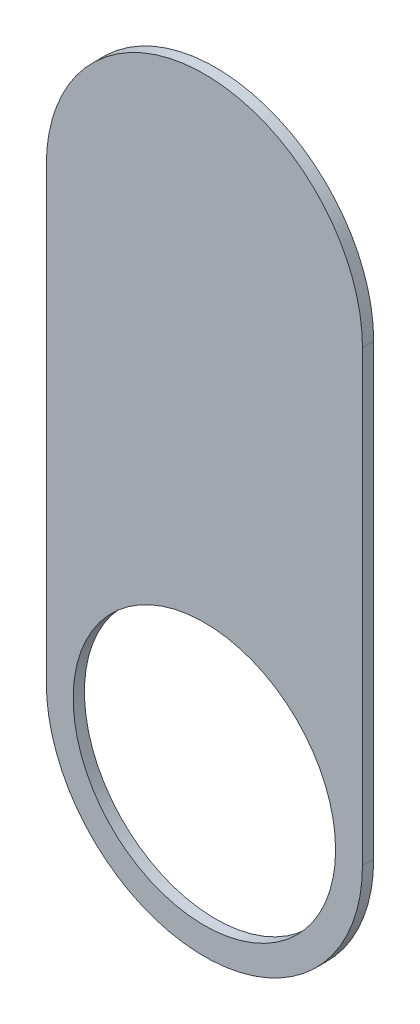
ISO-10303-21;
HEADER;
FILE_DESCRIPTION(('STEP AP214'),'2;1');
FILE_NAME('part.step','',(''),(''),'','','');
FILE_SCHEMA(('AUTOMOTIVE_DESIGN { 1 0 10303 214 1 1 1 1 }'));
ENDSEC;
DATA;
#1=APPLICATION_CONTEXT('core data for automotive mechanical design processes');
#2=APPLICATION_PROTOCOL_DEFINITION('international standard','automotive_design',2000,#1);
#3=PRODUCT_CONTEXT('',#1,'mechanical');
#4=PRODUCT('Part','Part','',(#3));
#5=PRODUCT_RELATED_PRODUCT_CATEGORY('part','',(#4));
#6=PRODUCT_DEFINITION_FORMATION('','',#4);
#7=PRODUCT_DEFINITION_CONTEXT('part definition',#1,'design');
#8=PRODUCT_DEFINITION('design','',#6,#7);
#9=PRODUCT_DEFINITION_SHAPE('','',#8);
#10=(LENGTH_UNIT() NAMED_UNIT(*) SI_UNIT(.MILLI.,.METRE.));
#11=(NAMED_UNIT(*) PLANE_ANGLE_UNIT() SI_UNIT($,.RADIAN.));
#12=(NAMED_UNIT(*) SI_UNIT($,.STERADIAN.) SOLID_ANGLE_UNIT());
#13=UNCERTAINTY_MEASURE_WITH_UNIT(LENGTH_MEASURE(1.E-05),#10,'distance_accuracy_value','');
#14=(GEOMETRIC_REPRESENTATION_CONTEXT(3) GLOBAL_UNCERTAINTY_ASSIGNED_CONTEXT((#13)) GLOBAL_UNIT_ASSIGNED_CONTEXT((#10,
#11,#12)) REPRESENTATION_CONTEXT('',''));
#15=CARTESIAN_POINT('',(0.,0.,0.));
#16=DIRECTION('',(0.,0.,1.));
#17=DIRECTION('',(1.,0.,0.));
#18=AXIS2_PLACEMENT_3D('',#15,#16,#17);
#19=CARTESIAN_POINT('',(35.8599994,113.5000016,0.));
#20=DIRECTION('',(-1.,0.,0.));
#21=DIRECTION('',(0.,1.,0.));
#22=AXIS2_PLACEMENT_3D('',#19,#20,#21);
#23=PLANE('',#22);
#24=DIRECTION('',(0.,1.,0.));
#25=VECTOR('',#24,1.);
#26=CARTESIAN_POINT('',(35.8599994,113.5000016,0.03556));
#27=LINE('',#26,#25);
#28=CARTESIAN_POINT('',(35.8599994,113.5000016,0.03556));
#29=VERTEX_POINT('',#28);
#30=CARTESIAN_POINT('',(35.8599994,114.9175756,0.03556));
#31=VERTEX_POINT('',#30);
#32=EDGE_CURVE('E11',#29,#31,#27,.T.);
#33=ORIENTED_EDGE('',*,*,#32,.F.);
#34=DIRECTION('',(0.,0.,1.));
#35=VECTOR('',#34,1.);
#36=CARTESIAN_POINT('',(35.8599994,113.5000016,0.));
#37=LINE('',#36,#35);
#38=CARTESIAN_POINT('',(35.8599994,113.5000016,0.));
#39=VERTEX_POINT('',#38);
#40=EDGE_CURVE('E24',#39,#29,#37,.T.);
#41=ORIENTED_EDGE('',*,*,#40,.F.);
#42=DIRECTION('',(0.,1.,0.));
#43=VECTOR('',#42,1.);
#44=CARTESIAN_POINT('',(35.8599994,113.5000016,0.));
#45=LINE('',#44,#43);
#46=CARTESIAN_POINT('',(35.8599994,114.9175756,0.));
#47=VERTEX_POINT('',#46);
#48=EDGE_CURVE('E96',#39,#47,#45,.T.);
#49=ORIENTED_EDGE('',*,*,#48,.T.);
#50=DIRECTION('',(0.,0.,1.));
#51=VECTOR('',#50,1.);
#52=CARTESIAN_POINT('',(35.8599994,114.9175756,0.));
#53=LINE('',#52,#51);
#54=EDGE_CURVE('E37',#47,#31,#53,.T.);
#55=ORIENTED_EDGE('',*,*,#54,.T.);
#56=EDGE_LOOP('',(#33,#41,#49,#55));
#57=FACE_BOUND('',#56,.T.);
#58=ADVANCED_FACE('F17',(#57),#23,.F.);
#59=CARTESIAN_POINT('',(35.3600004,113.5000016,0.));
#60=DIRECTION('',(0.,0.,-1.));
#61=DIRECTION('',(-1.,0.,0.));
#62=AXIS2_PLACEMENT_3D('',#59,#60,#61);
#63=CYLINDRICAL_SURFACE('',#62,0.499999000000002);
#64=CARTESIAN_POINT('',(35.3600004,113.5000016,0.03556));
#65=DIRECTION('',(0.,0.,1.));
#66=DIRECTION('',(-1.,0.,0.));
#67=AXIS2_PLACEMENT_3D('',#64,#65,#66);
#68=CIRCLE('',#67,0.499999000000002);
#69=CARTESIAN_POINT('',(34.8600014,113.5000016,0.03556));
#70=VERTEX_POINT('',#69);
#71=EDGE_CURVE('E92',#70,#29,#68,.T.);
#72=ORIENTED_EDGE('',*,*,#71,.F.);
#73=DIRECTION('',(0.,0.,1.));
#74=VECTOR('',#73,1.);
#75=CARTESIAN_POINT('',(34.8600014,113.5000016,0.));
#76=LINE('',#75,#74);
#77=CARTESIAN_POINT('',(34.8600014,113.5000016,0.));
#78=VERTEX_POINT('',#77);
#79=EDGE_CURVE('E90',#78,#70,#76,.T.);
#80=ORIENTED_EDGE('',*,*,#79,.F.);
#81=CARTESIAN_POINT('',(35.3600004,113.5000016,0.));
#82=DIRECTION('',(0.,0.,1.));
#83=DIRECTION('',(-1.,0.,0.));
#84=AXIS2_PLACEMENT_3D('',#81,#82,#83);
#85=CIRCLE('',#84,0.499999000000002);
#86=EDGE_CURVE('E88',#78,#39,#85,.T.);
#87=ORIENTED_EDGE('',*,*,#86,.T.);
#88=ORIENTED_EDGE('',*,*,#40,.T.);
#89=EDGE_LOOP('',(#72,#80,#87,#88));
#90=FACE_BOUND('',#89,.T.);
#91=ADVANCED_FACE('F111',(#90),#63,.T.);
#92=CARTESIAN_POINT('',(35.3600004,114.9175756,0.));
#93=DIRECTION('',(0.,0.,-1.));
#94=DIRECTION('',(1.,0.,0.));
#95=AXIS2_PLACEMENT_3D('',#92,#93,#94);
#96=CYLINDRICAL_SURFACE('',#95,0.499999000000002);
#97=CARTESIAN_POINT('',(35.3600004,114.9175756,0.03556));
#98=DIRECTION('',(0.,0.,1.));
#99=DIRECTION('',(1.,0.,0.));
#100=AXIS2_PLACEMENT_3D('',#97,#98,#99);
#101=CIRCLE('',#100,0.499999000000002);
#102=CARTESIAN_POINT('',(34.8600014,114.9175756,0.03556));
#103=VERTEX_POINT('',#102);
#104=EDGE_CURVE('E85',#31,#103,#101,.T.);
#105=ORIENTED_EDGE('',*,*,#104,.F.);
#106=ORIENTED_EDGE('',*,*,#54,.F.);
#107=CARTESIAN_POINT('',(35.3600004,114.9175756,0.));
#108=DIRECTION('',(0.,0.,1.));
#109=DIRECTION('',(1.,0.,0.));
#110=AXIS2_PLACEMENT_3D('',#107,#108,#109);
#111=CIRCLE('',#110,0.499999000000002);
#112=CARTESIAN_POINT('',(34.8600014,114.9175756,0.));
#113=VERTEX_POINT('',#112);
#114=EDGE_CURVE('E82',#47,#113,#111,.T.);
#115=ORIENTED_EDGE('',*,*,#114,.T.);
#116=DIRECTION('',(0.,0.,1.));
#117=VECTOR('',#116,1.);
#118=CARTESIAN_POINT('',(34.8600014,114.9175756,0.));
#119=LINE('',#118,#117);
#120=EDGE_CURVE('E80',#113,#103,#119,.T.);
#121=ORIENTED_EDGE('',*,*,#120,.T.);
#122=EDGE_LOOP('',(#105,#106,#115,#121));
#123=FACE_BOUND('',#122,.T.);
#124=ADVANCED_FACE('F104',(#123),#96,.T.);
#125=CARTESIAN_POINT('',(34.8600014,114.9175756,0.));
#126=DIRECTION('',(1.,0.,0.));
#127=DIRECTION('',(0.,-1.,0.));
#128=AXIS2_PLACEMENT_3D('',#125,#126,#127);
#129=PLANE('',#128);
#130=DIRECTION('',(0.,-1.,0.));
#131=VECTOR('',#130,1.);
#132=CARTESIAN_POINT('',(34.8600014,114.9175756,0.03556));
#133=LINE('',#132,#131);
#134=EDGE_CURVE('E77',#103,#70,#133,.T.);
#135=ORIENTED_EDGE('',*,*,#134,.F.);
#136=ORIENTED_EDGE('',*,*,#120,.F.);
#137=DIRECTION('',(0.,-1.,0.));
#138=VECTOR('',#137,1.);
#139=CARTESIAN_POINT('',(34.8600014,114.9175756,0.));
#140=LINE('',#139,#138);
#141=EDGE_CURVE('E68',#113,#78,#140,.T.);
#142=ORIENTED_EDGE('',*,*,#141,.T.);
#143=ORIENTED_EDGE('',*,*,#79,.T.);
#144=EDGE_LOOP('',(#135,#136,#142,#143));
#145=FACE_BOUND('',#144,.T.);
#146=ADVANCED_FACE('F110',(#145),#129,.F.);
#147=CARTESIAN_POINT('',(35.3600004,113.5000016,0.));
#148=DIRECTION('',(0.,0.,-1.));
#149=DIRECTION('',(1.,0.,0.));
#150=AXIS2_PLACEMENT_3D('',#147,#148,#149);
#151=CYLINDRICAL_SURFACE('',#150,0.41500044);
#152=DIRECTION('',(0.,0.,1.));
#153=VECTOR('',#152,1.);
#154=CARTESIAN_POINT('',(35.77500084,113.5000016,0.));
#155=LINE('',#154,#153);
#156=CARTESIAN_POINT('',(35.77500084,113.5000016,0.));
#157=VERTEX_POINT('',#156);
#158=CARTESIAN_POINT('',(35.77500084,113.5000016,0.03556));
#159=VERTEX_POINT('',#158);
#160=EDGE_CURVE('E62',#157,#159,#155,.T.);
#161=ORIENTED_EDGE('',*,*,#160,.T.);
#162=CARTESIAN_POINT('',(35.3600004,113.5000016,0.03556));
#163=DIRECTION('',(0.,0.,1.));
#164=DIRECTION('',(1.,0.,0.));
#165=AXIS2_PLACEMENT_3D('',#162,#163,#164);
#166=CIRCLE('',#165,0.41500044);
#167=EDGE_CURVE('E67',#159,#159,#166,.T.);
#168=ORIENTED_EDGE('',*,*,#167,.T.);
#169=ORIENTED_EDGE('',*,*,#160,.F.);
#170=CARTESIAN_POINT('',(35.3600004,113.5000016,0.));
#171=DIRECTION('',(0.,0.,1.));
#172=DIRECTION('',(1.,0.,0.));
#173=AXIS2_PLACEMENT_3D('',#170,#171,#172);
#174=CIRCLE('',#173,0.41500044);
#175=EDGE_CURVE('E65',#157,#157,#174,.T.);
#176=ORIENTED_EDGE('',*,*,#175,.F.);
#177=EDGE_LOOP('',(#161,#168,#169,#176));
#178=FACE_BOUND('',#177,.T.);
#179=ADVANCED_FACE('F64',(#178),#151,.F.);
#180=CARTESIAN_POINT('',(35.8599994,113.5000016,0.));
#181=DIRECTION('',(0.,0.,-1.));
#182=DIRECTION('',(-1.,0.,0.));
#183=AXIS2_PLACEMENT_3D('',#180,#181,#182);
#184=PLANE('',#183);
#185=ORIENTED_EDGE('',*,*,#48,.F.);
#186=ORIENTED_EDGE('',*,*,#86,.F.);
#187=ORIENTED_EDGE('',*,*,#141,.F.);
#188=ORIENTED_EDGE('',*,*,#114,.F.);
#189=EDGE_LOOP('',(#185,#186,#187,#188));
#190=FACE_BOUND('',#189,.T.);
#191=ORIENTED_EDGE('',*,*,#175,.T.);
#192=EDGE_LOOP('',(#191));
#193=FACE_BOUND('',#192,.T.);
#194=ADVANCED_FACE('F71',(#190,#193),#184,.T.);
#195=CARTESIAN_POINT('',(35.8599994,113.5000016,0.03556));
#196=DIRECTION('',(0.,0.,-1.));
#197=DIRECTION('',(-1.,0.,0.));
#198=AXIS2_PLACEMENT_3D('',#195,#196,#197);
#199=PLANE('',#198);
#200=ORIENTED_EDGE('',*,*,#134,.T.);
#201=ORIENTED_EDGE('',*,*,#71,.T.);
#202=ORIENTED_EDGE('',*,*,#32,.T.);
#203=ORIENTED_EDGE('',*,*,#104,.T.);
#204=EDGE_LOOP('',(#200,#201,#202,#203));
#205=FACE_BOUND('',#204,.T.);
#206=ORIENTED_EDGE('',*,*,#167,.F.);
#207=EDGE_LOOP('',(#206));
#208=FACE_BOUND('',#207,.T.);
#209=ADVANCED_FACE('F107',(#205,#208),#199,.F.);
#210=CLOSED_SHELL('',(#58,#91,#124,#146,#179,#194,#209));
#211=MANIFOLD_SOLID_BREP('B1',#210);
#212=ADVANCED_BREP_SHAPE_REPRESENTATION('',(#18,#211),#14);
#213=SHAPE_DEFINITION_REPRESENTATION(#9,#212);
ENDSEC;
END-ISO-10303-21;
